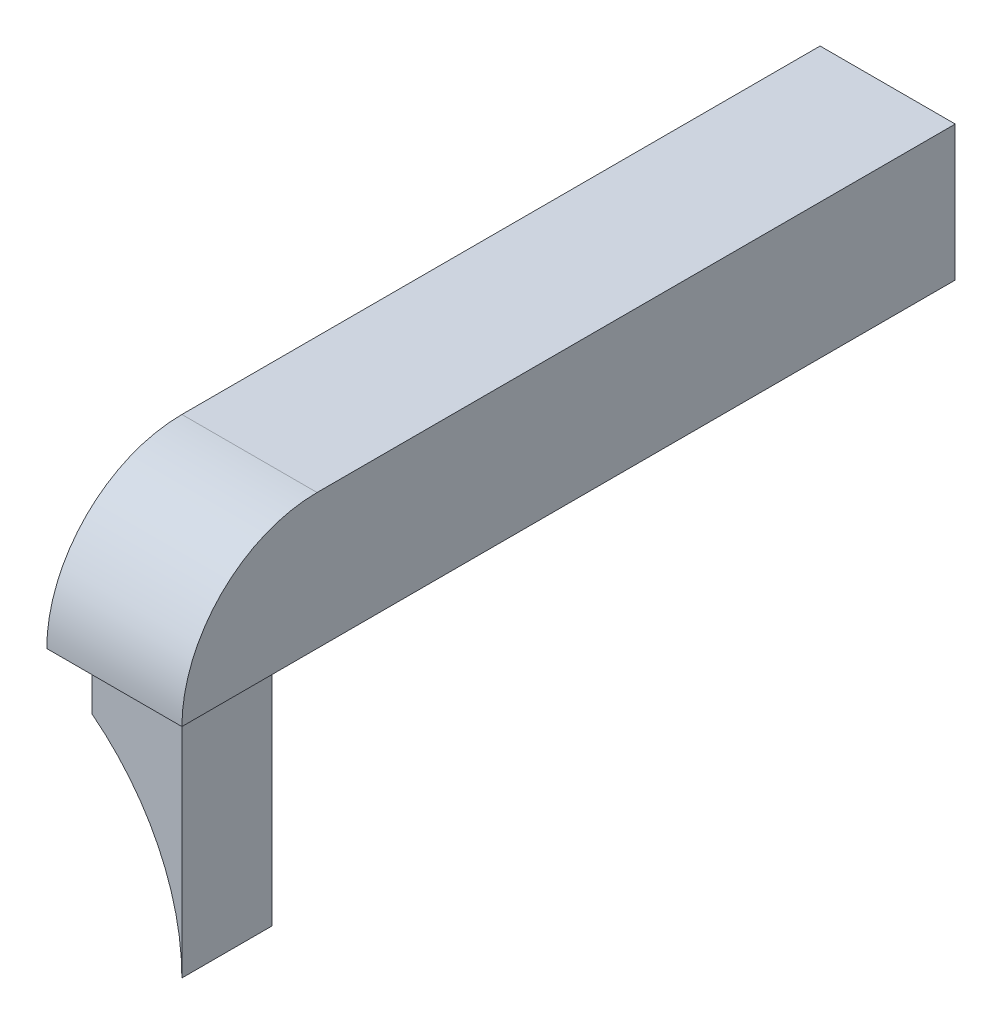
ISO-10303-21;
HEADER;
FILE_DESCRIPTION(('STEP AP214'),'2;1');
FILE_NAME('part.step','',(''),(''),'','','');
FILE_SCHEMA(('AUTOMOTIVE_DESIGN { 1 0 10303 214 1 1 1 1 }'));
ENDSEC;
DATA;
#1=APPLICATION_CONTEXT('core data for automotive mechanical design processes');
#2=APPLICATION_PROTOCOL_DEFINITION('international standard','automotive_design',2000,#1);
#3=PRODUCT_CONTEXT('',#1,'mechanical');
#4=PRODUCT('Part','Part','',(#3));
#5=PRODUCT_RELATED_PRODUCT_CATEGORY('part','',(#4));
#6=PRODUCT_DEFINITION_FORMATION('','',#4);
#7=PRODUCT_DEFINITION_CONTEXT('part definition',#1,'design');
#8=PRODUCT_DEFINITION('design','',#6,#7);
#9=PRODUCT_DEFINITION_SHAPE('','',#8);
#10=(LENGTH_UNIT() NAMED_UNIT(*) SI_UNIT(.MILLI.,.METRE.));
#11=(NAMED_UNIT(*) PLANE_ANGLE_UNIT() SI_UNIT($,.RADIAN.));
#12=(NAMED_UNIT(*) SI_UNIT($,.STERADIAN.) SOLID_ANGLE_UNIT());
#13=UNCERTAINTY_MEASURE_WITH_UNIT(LENGTH_MEASURE(1.E-05),#10,'distance_accuracy_value','');
#14=(GEOMETRIC_REPRESENTATION_CONTEXT(3) GLOBAL_UNCERTAINTY_ASSIGNED_CONTEXT((#13)) GLOBAL_UNIT_ASSIGNED_CONTEXT((#10,
#11,#12)) REPRESENTATION_CONTEXT('',''));
#15=CARTESIAN_POINT('',(0.,0.,0.));
#16=DIRECTION('',(0.,0.,1.));
#17=DIRECTION('',(1.,0.,0.));
#18=AXIS2_PLACEMENT_3D('',#15,#16,#17);
#19=CARTESIAN_POINT('',(13.7705009063984,28.2267058219209,96.5230796597994));
#20=DIRECTION('',(1.,0.,0.));
#21=DIRECTION('',(0.,0.,-1.));
#22=AXIS2_PLACEMENT_3D('',#19,#20,#21);
#23=CYLINDRICAL_SURFACE('',#22,13.2426406871193);
#24=CARTESIAN_POINT('',(27.0131415935177,28.2267058219209,96.5230796597994));
#25=DIRECTION('',(-1.,0.,0.));
#26=DIRECTION('',(0.,0.,1.));
#27=AXIS2_PLACEMENT_3D('',#24,#25,#26);
#28=CIRCLE('',#27,13.2426406871193);
#29=CARTESIAN_POINT('',(27.0131415935177,41.4693465090402,96.5230796597994));
#30=VERTEX_POINT('',#29);
#31=CARTESIAN_POINT('',(27.0131415935177,33.619477968083,108.617935630324));
#32=VERTEX_POINT('',#31);
#33=EDGE_CURVE('E248',#30,#32,#28,.F.);
#34=ORIENTED_EDGE('',*,*,#33,.T.);
#35=DIRECTION('',(1.,0.,0.));
#36=VECTOR('',#35,1.);
#37=CARTESIAN_POINT('',(13.7705009063984,33.619477968083,108.617935630324));
#38=LINE('',#37,#36);
#39=CARTESIAN_POINT('',(18.5278602192791,33.619477968083,108.617935630324));
#40=VERTEX_POINT('',#39);
#41=EDGE_CURVE('E60',#32,#40,#38,.F.);
#42=ORIENTED_EDGE('',*,*,#41,.T.);
#43=CARTESIAN_POINT('',(18.5278602192791,28.2267058219209,96.5230796597994));
#44=DIRECTION('',(1.,0.,0.));
#45=DIRECTION('',(0.,0.,-1.));
#46=AXIS2_PLACEMENT_3D('',#43,#44,#45);
#47=CIRCLE('',#46,13.2426406871193);
#48=CARTESIAN_POINT('',(18.5278602192791,41.4693465090402,96.5230796597994));
#49=VERTEX_POINT('',#48);
#50=EDGE_CURVE('E249',#49,#40,#47,.T.);
#51=ORIENTED_EDGE('',*,*,#50,.F.);
#52=DIRECTION('',(1.,0.,0.));
#53=VECTOR('',#52,1.);
#54=CARTESIAN_POINT('',(13.7705009063984,41.4693465090402,96.5230796597994));
#55=LINE('',#54,#53);
#56=EDGE_CURVE('E262',#49,#30,#55,.T.);
#57=ORIENTED_EDGE('',*,*,#56,.T.);
#58=EDGE_LOOP('',(#34,#42,#51,#57));
#59=FACE_BOUND('',#58,.T.);
#60=ADVANCED_FACE('F38',(#59),#23,.F.);
#61=CARTESIAN_POINT('',(13.7705009063984,46.2267058219209,11.5230796597994));
#62=DIRECTION('',(0.,0.,-1.));
#63=DIRECTION('',(-1.,0.,0.));
#64=AXIS2_PLACEMENT_3D('',#61,#62,#63);
#65=PLANE('',#64);
#66=DIRECTION('',(0.,1.,0.));
#67=VECTOR('',#66,1.);
#68=CARTESIAN_POINT('',(31.7705009063984,46.2267058219209,11.5230796597994));
#69=LINE('',#68,#67);
#70=CARTESIAN_POINT('',(31.7705009063984,28.2267058219209,11.5230796597994));
#71=VERTEX_POINT('',#70);
#72=CARTESIAN_POINT('',(31.7705009063984,46.2267058219209,11.5230796597994));
#73=VERTEX_POINT('',#72);
#74=EDGE_CURVE('E300',#71,#73,#69,.T.);
#75=ORIENTED_EDGE('',*,*,#74,.F.);
#76=DIRECTION('',(1.,0.,0.));
#77=VECTOR('',#76,1.);
#78=CARTESIAN_POINT('',(13.7705009063984,28.2267058219209,11.5230796597994));
#79=LINE('',#78,#77);
#80=CARTESIAN_POINT('',(13.7705009063984,28.2267058219209,11.5230796597994));
#81=VERTEX_POINT('',#80);
#82=EDGE_CURVE('E297',#81,#71,#79,.T.);
#83=ORIENTED_EDGE('',*,*,#82,.F.);
#84=DIRECTION('',(0.,1.,0.));
#85=VECTOR('',#84,1.);
#86=CARTESIAN_POINT('',(13.7705009063984,46.2267058219209,11.5230796597994));
#87=LINE('',#86,#85);
#88=CARTESIAN_POINT('',(13.7705009063984,46.2267058219209,11.5230796597994));
#89=VERTEX_POINT('',#88);
#90=EDGE_CURVE('E284',#81,#89,#87,.T.);
#91=ORIENTED_EDGE('',*,*,#90,.T.);
#92=DIRECTION('',(1.,0.,0.));
#93=VECTOR('',#92,1.);
#94=CARTESIAN_POINT('',(13.7705009063984,46.2267058219209,11.5230796597994));
#95=LINE('',#94,#93);
#96=EDGE_CURVE('E315',#89,#73,#95,.T.);
#97=ORIENTED_EDGE('',*,*,#96,.T.);
#98=EDGE_LOOP('',(#75,#83,#91,#97));
#99=FACE_BOUND('',#98,.T.);
#100=DIRECTION('',(1.,0.,0.));
#101=VECTOR('',#100,1.);
#102=CARTESIAN_POINT('',(13.7705009063984,32.9840651348016,11.5230796597994));
#103=LINE('',#102,#101);
#104=CARTESIAN_POINT('',(18.5278602192791,32.9840651348016,11.5230796597994));
#105=VERTEX_POINT('',#104);
#106=CARTESIAN_POINT('',(27.0131415935177,32.9840651348016,11.5230796597994));
#107=VERTEX_POINT('',#106);
#108=EDGE_CURVE('E252',#105,#107,#103,.T.);
#109=ORIENTED_EDGE('',*,*,#108,.T.);
#110=DIRECTION('',(0.,1.,0.));
#111=VECTOR('',#110,1.);
#112=CARTESIAN_POINT('',(27.0131415935177,46.2267058219209,11.5230796597994));
#113=LINE('',#112,#111);
#114=CARTESIAN_POINT('',(27.0131415935177,41.4693465090402,11.5230796597994));
#115=VERTEX_POINT('',#114);
#116=EDGE_CURVE('E261',#107,#115,#113,.T.);
#117=ORIENTED_EDGE('',*,*,#116,.T.);
#118=DIRECTION('',(1.,0.,0.));
#119=VECTOR('',#118,1.);
#120=CARTESIAN_POINT('',(13.7705009063984,41.4693465090402,11.5230796597994));
#121=LINE('',#120,#119);
#122=CARTESIAN_POINT('',(18.5278602192791,41.4693465090402,11.5230796597994));
#123=VERTEX_POINT('',#122);
#124=EDGE_CURVE('E266',#123,#115,#121,.T.);
#125=ORIENTED_EDGE('',*,*,#124,.F.);
#126=DIRECTION('',(0.,1.,0.));
#127=VECTOR('',#126,1.);
#128=CARTESIAN_POINT('',(18.5278602192791,28.2267058219209,11.5230796597994));
#129=LINE('',#128,#127);
#130=EDGE_CURVE('E247',#105,#123,#129,.T.);
#131=ORIENTED_EDGE('',*,*,#130,.F.);
#132=EDGE_LOOP('',(#109,#117,#125,#131));
#133=FACE_BOUND('',#132,.T.);
#134=ADVANCED_FACE('F360',(#99,#133),#65,.T.);
#135=CARTESIAN_POINT('',(13.7705009063984,28.2267058219209,114.523079659799));
#136=DIRECTION('',(1.,0.,0.));
#137=DIRECTION('',(0.,0.,-1.));
#138=AXIS2_PLACEMENT_3D('',#135,#136,#137);
#139=PLANE('',#138);
#140=DIRECTION('',(0.,0.,-1.));
#141=VECTOR('',#140,1.);
#142=CARTESIAN_POINT('',(13.7705009063984,28.2267058219209,114.523079659799));
#143=LINE('',#142,#141);
#144=CARTESIAN_POINT('',(13.7705009063984,28.2267058219209,114.523079659799));
#145=VERTEX_POINT('',#144);
#146=EDGE_CURVE('E281',#145,#81,#143,.T.);
#147=ORIENTED_EDGE('',*,*,#146,.F.);
#148=CARTESIAN_POINT('',(13.7705009063984,28.2267058219209,96.5230796597994));
#149=DIRECTION('',(1.,0.,0.));
#150=DIRECTION('',(0.,0.,1.));
#151=AXIS2_PLACEMENT_3D('',#148,#149,#150);
#152=CIRCLE('',#151,18.);
#153=CARTESIAN_POINT('',(13.7705009063984,46.2267058219209,96.5230796597994));
#154=VERTEX_POINT('',#153);
#155=EDGE_CURVE('E293',#154,#145,#152,.T.);
#156=ORIENTED_EDGE('',*,*,#155,.F.);
#157=DIRECTION('',(0.,0.,1.));
#158=VECTOR('',#157,1.);
#159=CARTESIAN_POINT('',(13.7705009063984,46.2267058219209,96.5230796597994));
#160=LINE('',#159,#158);
#161=EDGE_CURVE('E289',#89,#154,#160,.T.);
#162=ORIENTED_EDGE('',*,*,#161,.F.);
#163=ORIENTED_EDGE('',*,*,#90,.F.);
#164=EDGE_LOOP('',(#147,#156,#162,#163));
#165=FACE_BOUND('',#164,.T.);
#166=ADVANCED_FACE('F367',(#165),#139,.F.);
#167=CARTESIAN_POINT('',(13.7705009063984,46.2267058219209,96.5230796597994));
#168=DIRECTION('',(0.,1.,0.));
#169=DIRECTION('',(0.,0.,1.));
#170=AXIS2_PLACEMENT_3D('',#167,#168,#169);
#171=PLANE('',#170);
#172=DIRECTION('',(0.,0.,1.));
#173=VECTOR('',#172,1.);
#174=CARTESIAN_POINT('',(31.7705009063984,46.2267058219209,96.5230796597994));
#175=LINE('',#174,#173);
#176=CARTESIAN_POINT('',(31.7705009063984,46.2267058219209,96.5230796597994));
#177=VERTEX_POINT('',#176);
#178=EDGE_CURVE('E304',#73,#177,#175,.T.);
#179=ORIENTED_EDGE('',*,*,#178,.F.);
#180=ORIENTED_EDGE('',*,*,#96,.F.);
#181=ORIENTED_EDGE('',*,*,#161,.T.);
#182=DIRECTION('',(1.,0.,0.));
#183=VECTOR('',#182,1.);
#184=CARTESIAN_POINT('',(13.7705009063984,46.2267058219209,96.5230796597994));
#185=LINE('',#184,#183);
#186=EDGE_CURVE('E311',#154,#177,#185,.T.);
#187=ORIENTED_EDGE('',*,*,#186,.T.);
#188=EDGE_LOOP('',(#179,#180,#181,#187));
#189=FACE_BOUND('',#188,.T.);
#190=ADVANCED_FACE('F383',(#189),#171,.T.);
#191=CARTESIAN_POINT('',(31.7705009063984,28.2267058219209,114.523079659799));
#192=DIRECTION('',(-1.,0.,0.));
#193=DIRECTION('',(0.,0.,1.));
#194=AXIS2_PLACEMENT_3D('',#191,#192,#193);
#195=PLANE('',#194);
#196=CARTESIAN_POINT('',(31.7705009063984,28.2267058219209,96.5230796597994));
#197=DIRECTION('',(1.,0.,0.));
#198=DIRECTION('',(0.,0.,1.));
#199=AXIS2_PLACEMENT_3D('',#196,#197,#198);
#200=CIRCLE('',#199,18.);
#201=CARTESIAN_POINT('',(31.7705009063984,28.2267058219209,114.523079659799));
#202=VERTEX_POINT('',#201);
#203=EDGE_CURVE('E285',#177,#202,#200,.T.);
#204=ORIENTED_EDGE('',*,*,#203,.T.);
#205=DIRECTION('',(0.,0.,-1.));
#206=VECTOR('',#205,1.);
#207=CARTESIAN_POINT('',(31.7705009063984,28.2267058219209,96.5230796597994));
#208=LINE('',#207,#206);
#209=EDGE_CURVE('E265',#202,#71,#208,.T.);
#210=ORIENTED_EDGE('',*,*,#209,.T.);
#211=ORIENTED_EDGE('',*,*,#74,.T.);
#212=ORIENTED_EDGE('',*,*,#178,.T.);
#213=EDGE_LOOP('',(#204,#210,#211,#212));
#214=FACE_BOUND('',#213,.T.);
#215=ADVANCED_FACE('F381',(#214),#195,.F.);
#216=CARTESIAN_POINT('',(13.7705009063984,28.2267058219209,96.5230796597994));
#217=DIRECTION('',(1.,0.,0.));
#218=DIRECTION('',(0.,0.,-1.));
#219=AXIS2_PLACEMENT_3D('',#216,#217,#218);
#220=CYLINDRICAL_SURFACE('',#219,18.);
#221=ORIENTED_EDGE('',*,*,#203,.F.);
#222=ORIENTED_EDGE('',*,*,#186,.F.);
#223=ORIENTED_EDGE('',*,*,#155,.T.);
#224=DIRECTION('',(1.,0.,0.));
#225=VECTOR('',#224,1.);
#226=CARTESIAN_POINT('',(13.7705009063984,28.2267058219209,114.523079659799));
#227=LINE('',#226,#225);
#228=EDGE_CURVE('E314',#145,#202,#227,.T.);
#229=ORIENTED_EDGE('',*,*,#228,.T.);
#230=EDGE_LOOP('',(#221,#222,#223,#229));
#231=FACE_BOUND('',#230,.T.);
#232=ADVANCED_FACE('F378',(#231),#220,.T.);
#233=CARTESIAN_POINT('',(13.7705009063984,28.2267058219209,96.5230796597994));
#234=DIRECTION('',(0.,-1.,0.));
#235=DIRECTION('',(0.,0.,-1.));
#236=AXIS2_PLACEMENT_3D('',#233,#234,#235);
#237=PLANE('',#236);
#238=DIRECTION('',(-1.,0.,0.));
#239=VECTOR('',#238,1.);
#240=CARTESIAN_POINT('',(28.7705009063984,28.2267058219209,111.523079659799));
#241=LINE('',#240,#239);
#242=CARTESIAN_POINT('',(28.7705009063984,28.2267058219209,111.523079659799));
#243=VERTEX_POINT('',#242);
#244=CARTESIAN_POINT('',(16.7705009063984,28.2267058219209,111.523079659799));
#245=VERTEX_POINT('',#244);
#246=EDGE_CURVE('E209',#243,#245,#241,.T.);
#247=ORIENTED_EDGE('',*,*,#246,.F.);
#248=DIRECTION('',(0.,0.,-1.));
#249=VECTOR('',#248,1.);
#250=CARTESIAN_POINT('',(28.7705009063984,28.2267058219209,111.523079659799));
#251=LINE('',#250,#249);
#252=CARTESIAN_POINT('',(28.7705009063984,28.2267058219209,99.5230796597994));
#253=VERTEX_POINT('',#252);
#254=EDGE_CURVE('E235',#243,#253,#251,.T.);
#255=ORIENTED_EDGE('',*,*,#254,.T.);
#256=DIRECTION('',(-1.,0.,0.));
#257=VECTOR('',#256,1.);
#258=CARTESIAN_POINT('',(28.7705009063984,28.2267058219209,99.5230796597994));
#259=LINE('',#258,#257);
#260=CARTESIAN_POINT('',(16.7705009063984,28.2267058219209,99.5230796597994));
#261=VERTEX_POINT('',#260);
#262=EDGE_CURVE('E222',#253,#261,#259,.T.);
#263=ORIENTED_EDGE('',*,*,#262,.T.);
#264=DIRECTION('',(0.,0.,-1.));
#265=VECTOR('',#264,1.);
#266=CARTESIAN_POINT('',(16.7705009063984,28.2267058219209,111.523079659799));
#267=LINE('',#266,#265);
#268=EDGE_CURVE('E231',#245,#261,#267,.T.);
#269=ORIENTED_EDGE('',*,*,#268,.F.);
#270=EDGE_LOOP('',(#247,#255,#263,#269));
#271=FACE_BOUND('',#270,.T.);
#272=ORIENTED_EDGE('',*,*,#209,.F.);
#273=ORIENTED_EDGE('',*,*,#228,.F.);
#274=ORIENTED_EDGE('',*,*,#146,.T.);
#275=ORIENTED_EDGE('',*,*,#82,.T.);
#276=EDGE_LOOP('',(#272,#273,#274,#275));
#277=FACE_BOUND('',#276,.T.);
#278=ADVANCED_FACE('F370',(#271,#277),#237,.T.);
#279=CARTESIAN_POINT('',(18.5278602192791,28.2267058219209,114.523079659799));
#280=DIRECTION('',(1.,0.,0.));
#281=DIRECTION('',(0.,0.,-1.));
#282=AXIS2_PLACEMENT_3D('',#279,#280,#281);
#283=PLANE('',#282);
#284=DIRECTION('',(0.,-1.,0.));
#285=VECTOR('',#284,1.);
#286=CARTESIAN_POINT('',(18.5278602192791,33.0267058219209,101.28043897268));
#287=LINE('',#286,#285);
#288=CARTESIAN_POINT('',(18.5278602192791,32.9840651348016,101.28043897268));
#289=VERTEX_POINT('',#288);
#290=CARTESIAN_POINT('',(18.5278602192791,19.2513021127566,101.28043897268));
#291=VERTEX_POINT('',#290);
#292=EDGE_CURVE('E186',#289,#291,#287,.T.);
#293=ORIENTED_EDGE('',*,*,#292,.F.);
#294=DIRECTION('',(0.,0.,-1.));
#295=VECTOR('',#294,1.);
#296=CARTESIAN_POINT('',(18.5278602192791,32.9840651348016,114.523079659799));
#297=LINE('',#296,#295);
#298=EDGE_CURVE('E244',#289,#105,#297,.T.);
#299=ORIENTED_EDGE('',*,*,#298,.T.);
#300=ORIENTED_EDGE('',*,*,#130,.T.);
#301=DIRECTION('',(0.,0.,1.));
#302=VECTOR('',#301,1.);
#303=CARTESIAN_POINT('',(18.5278602192791,41.4693465090402,114.523079659799));
#304=LINE('',#303,#302);
#305=EDGE_CURVE('E253',#123,#49,#304,.T.);
#306=ORIENTED_EDGE('',*,*,#305,.T.);
#307=ORIENTED_EDGE('',*,*,#50,.T.);
#308=CARTESIAN_POINT('',(18.5278602192791,34.0267058219209,109.531262228567));
#309=DIRECTION('',(1.,0.,0.));
#310=DIRECTION('',(0.,0.,-1.));
#311=AXIS2_PLACEMENT_3D('',#308,#309,#310);
#312=CIRCLE('',#311,1.);
#313=CARTESIAN_POINT('',(18.5278602192791,33.0267058219209,109.531262228567));
#314=VERTEX_POINT('',#313);
#315=EDGE_CURVE('E11',#40,#314,#312,.F.);
#316=ORIENTED_EDGE('',*,*,#315,.T.);
#317=DIRECTION('',(0.,0.,-1.));
#318=VECTOR('',#317,1.);
#319=CARTESIAN_POINT('',(18.5278602192791,33.0267058219209,109.765720346919));
#320=LINE('',#319,#318);
#321=CARTESIAN_POINT('',(18.5278602192791,33.0267058219209,109.765720346919));
#322=VERTEX_POINT('',#321);
#323=EDGE_CURVE('E167',#322,#314,#320,.T.);
#324=ORIENTED_EDGE('',*,*,#323,.F.);
#325=DIRECTION('',(0.,-1.,0.));
#326=VECTOR('',#325,1.);
#327=CARTESIAN_POINT('',(18.5278602192791,33.0267058219209,109.765720346919));
#328=LINE('',#327,#326);
#329=CARTESIAN_POINT('',(18.5278602192791,19.2513021127566,109.765720346919));
#330=VERTEX_POINT('',#329);
#331=EDGE_CURVE('E179',#322,#330,#328,.T.);
#332=ORIENTED_EDGE('',*,*,#331,.T.);
#333=DIRECTION('',(0.,0.,-1.));
#334=VECTOR('',#333,1.);
#335=CARTESIAN_POINT('',(18.5278602192791,19.2513021127566,111.523079659799));
#336=LINE('',#335,#334);
#337=EDGE_CURVE('E333',#291,#330,#336,.F.);
#338=ORIENTED_EDGE('',*,*,#337,.F.);
#339=EDGE_LOOP('',(#293,#299,#300,#306,#307,#316,#324,#332,#338));
#340=FACE_BOUND('',#339,.T.);
#341=ADVANCED_FACE('F347',(#340),#283,.T.);
#342=CARTESIAN_POINT('',(13.7705009063984,41.4693465090402,96.5230796597994));
#343=DIRECTION('',(0.,1.,0.));
#344=DIRECTION('',(0.,0.,1.));
#345=AXIS2_PLACEMENT_3D('',#342,#343,#344);
#346=PLANE('',#345);
#347=DIRECTION('',(0.,0.,1.));
#348=VECTOR('',#347,1.);
#349=CARTESIAN_POINT('',(27.0131415935177,41.4693465090402,96.5230796597994));
#350=LINE('',#349,#348);
#351=EDGE_CURVE('E257',#115,#30,#350,.T.);
#352=ORIENTED_EDGE('',*,*,#351,.T.);
#353=ORIENTED_EDGE('',*,*,#56,.F.);
#354=ORIENTED_EDGE('',*,*,#305,.F.);
#355=ORIENTED_EDGE('',*,*,#124,.T.);
#356=EDGE_LOOP('',(#352,#353,#354,#355));
#357=FACE_BOUND('',#356,.T.);
#358=ADVANCED_FACE('F413',(#357),#346,.F.);
#359=CARTESIAN_POINT('',(27.0131415935177,28.2267058219209,114.523079659799));
#360=DIRECTION('',(-1.,0.,0.));
#361=DIRECTION('',(0.,0.,1.));
#362=AXIS2_PLACEMENT_3D('',#359,#360,#361);
#363=PLANE('',#362);
#364=DIRECTION('',(0.,0.,-1.));
#365=VECTOR('',#364,1.);
#366=CARTESIAN_POINT('',(27.0131415935177,32.9840651348016,96.5230796597994));
#367=LINE('',#366,#365);
#368=CARTESIAN_POINT('',(27.0131415935177,32.9840651348016,101.28043897268));
#369=VERTEX_POINT('',#368);
#370=EDGE_CURVE('E243',#369,#107,#367,.T.);
#371=ORIENTED_EDGE('',*,*,#370,.F.);
#372=DIRECTION('',(0.,-1.,0.));
#373=VECTOR('',#372,1.);
#374=CARTESIAN_POINT('',(27.0131415935177,33.0267058219209,101.28043897268));
#375=LINE('',#374,#373);
#376=CARTESIAN_POINT('',(27.0131415935177,6.51592180974206,101.28043897268));
#377=VERTEX_POINT('',#376);
#378=EDGE_CURVE('E180',#369,#377,#375,.T.);
#379=ORIENTED_EDGE('',*,*,#378,.T.);
#380=DIRECTION('',(0.,0.,-1.));
#381=VECTOR('',#380,1.);
#382=CARTESIAN_POINT('',(27.0131415935177,6.51592180974206,111.523079659799));
#383=LINE('',#382,#381);
#384=CARTESIAN_POINT('',(27.0131415935177,6.51592180974206,109.765720346919));
#385=VERTEX_POINT('',#384);
#386=EDGE_CURVE('E175',#385,#377,#383,.T.);
#387=ORIENTED_EDGE('',*,*,#386,.F.);
#388=DIRECTION('',(0.,-1.,0.));
#389=VECTOR('',#388,1.);
#390=CARTESIAN_POINT('',(27.0131415935177,33.0267058219209,109.765720346919));
#391=LINE('',#390,#389);
#392=CARTESIAN_POINT('',(27.0131415935177,33.0267058219209,109.765720346919));
#393=VERTEX_POINT('',#392);
#394=EDGE_CURVE('E170',#393,#385,#391,.T.);
#395=ORIENTED_EDGE('',*,*,#394,.F.);
#396=DIRECTION('',(0.,0.,1.));
#397=VECTOR('',#396,1.);
#398=CARTESIAN_POINT('',(27.0131415935177,33.0267058219209,109.765720346919));
#399=LINE('',#398,#397);
#400=CARTESIAN_POINT('',(27.0131415935177,33.0267058219209,109.531262228567));
#401=VERTEX_POINT('',#400);
#402=EDGE_CURVE('E158',#401,#393,#399,.T.);
#403=ORIENTED_EDGE('',*,*,#402,.F.);
#404=CARTESIAN_POINT('',(27.0131415935177,34.0267058219209,109.531262228567));
#405=DIRECTION('',(-1.,0.,0.));
#406=DIRECTION('',(0.,0.,1.));
#407=AXIS2_PLACEMENT_3D('',#404,#405,#406);
#408=CIRCLE('',#407,1.);
#409=EDGE_CURVE('E47',#401,#32,#408,.F.);
#410=ORIENTED_EDGE('',*,*,#409,.T.);
#411=ORIENTED_EDGE('',*,*,#33,.F.);
#412=ORIENTED_EDGE('',*,*,#351,.F.);
#413=ORIENTED_EDGE('',*,*,#116,.F.);
#414=EDGE_LOOP('',(#371,#379,#387,#395,#403,#410,#411,#412,#413));
#415=FACE_BOUND('',#414,.T.);
#416=ADVANCED_FACE('F172',(#415),#363,.T.);
#417=CARTESIAN_POINT('',(13.7705009063984,32.9840651348016,96.5230796597994));
#418=DIRECTION('',(0.,-1.,0.));
#419=DIRECTION('',(0.,0.,-1.));
#420=AXIS2_PLACEMENT_3D('',#417,#418,#419);
#421=PLANE('',#420);
#422=ORIENTED_EDGE('',*,*,#298,.F.);
#423=DIRECTION('',(1.,0.,0.));
#424=VECTOR('',#423,1.);
#425=CARTESIAN_POINT('',(13.7705009063984,32.9840651348016,101.28043897268));
#426=LINE('',#425,#424);
#427=EDGE_CURVE('E193',#289,#369,#426,.T.);
#428=ORIENTED_EDGE('',*,*,#427,.T.);
#429=ORIENTED_EDGE('',*,*,#370,.T.);
#430=ORIENTED_EDGE('',*,*,#108,.F.);
#431=EDGE_LOOP('',(#422,#428,#429,#430));
#432=FACE_BOUND('',#431,.T.);
#433=ADVANCED_FACE('F374',(#432),#421,.F.);
#434=CARTESIAN_POINT('',(-2.22949909360185,-3.77329417807921,111.523079659799));
#435=DIRECTION('',(0.,0.,-1.));
#436=DIRECTION('',(-1.,0.,0.));
#437=AXIS2_PLACEMENT_3D('',#434,#435,#436);
#438=CYLINDRICAL_SURFACE('',#437,31.0000000000003);
#439=CARTESIAN_POINT('',(-2.22949909360185,-3.77329417807921,101.28043897268));
#440=DIRECTION('',(0.,0.,-1.));
#441=DIRECTION('',(-1.,0.,0.));
#442=AXIS2_PLACEMENT_3D('',#439,#440,#441);
#443=CIRCLE('',#442,31.0000000000003);
#444=EDGE_CURVE('E324',#377,#291,#443,.F.);
#445=ORIENTED_EDGE('',*,*,#444,.T.);
#446=ORIENTED_EDGE('',*,*,#337,.T.);
#447=CARTESIAN_POINT('',(-2.22949909360185,-3.77329417807921,109.765720346919));
#448=DIRECTION('',(0.,0.,1.));
#449=DIRECTION('',(1.,0.,0.));
#450=AXIS2_PLACEMENT_3D('',#447,#448,#449);
#451=CIRCLE('',#450,31.0000000000003);
#452=EDGE_CURVE('E330',#330,#385,#451,.F.);
#453=ORIENTED_EDGE('',*,*,#452,.T.);
#454=ORIENTED_EDGE('',*,*,#386,.T.);
#455=EDGE_LOOP('',(#445,#446,#453,#454));
#456=FACE_BOUND('',#455,.T.);
#457=CARTESIAN_POINT('',(-2.22949909360185,-3.77329417807921,99.5230796597994));
#458=DIRECTION('',(0.,0.,-1.));
#459=DIRECTION('',(1.,0.,0.));
#460=AXIS2_PLACEMENT_3D('',#457,#458,#459);
#461=CIRCLE('',#460,31.0000000000003);
#462=CARTESIAN_POINT('',(16.7705009063984,20.7216032497527,99.5230796597994));
#463=VERTEX_POINT('',#462);
#464=CARTESIAN_POINT('',(28.7705009063984,-3.77329417807919,99.5230796597994));
#465=VERTEX_POINT('',#464);
#466=EDGE_CURVE('E200',#463,#465,#461,.T.);
#467=ORIENTED_EDGE('',*,*,#466,.T.);
#468=DIRECTION('',(0.,0.,-1.));
#469=VECTOR('',#468,1.);
#470=CARTESIAN_POINT('',(28.7705009063984,-3.77329417807919,111.523079659799));
#471=LINE('',#470,#469);
#472=CARTESIAN_POINT('',(28.7705009063984,-3.77329417807919,111.523079659799));
#473=VERTEX_POINT('',#472);
#474=EDGE_CURVE('E239',#473,#465,#471,.T.);
#475=ORIENTED_EDGE('',*,*,#474,.F.);
#476=CARTESIAN_POINT('',(-2.22949909360185,-3.77329417807921,111.523079659799));
#477=DIRECTION('',(0.,0.,-1.));
#478=DIRECTION('',(1.,0.,0.));
#479=AXIS2_PLACEMENT_3D('',#476,#477,#478);
#480=CIRCLE('',#479,31.0000000000003);
#481=CARTESIAN_POINT('',(16.7705009063984,20.7216032497527,111.523079659799));
#482=VERTEX_POINT('',#481);
#483=EDGE_CURVE('E201',#482,#473,#480,.T.);
#484=ORIENTED_EDGE('',*,*,#483,.F.);
#485=DIRECTION('',(0.,0.,-1.));
#486=VECTOR('',#485,1.);
#487=CARTESIAN_POINT('',(16.7705009063984,20.7216032497527,111.523079659799));
#488=LINE('',#487,#486);
#489=EDGE_CURVE('E215',#482,#463,#488,.T.);
#490=ORIENTED_EDGE('',*,*,#489,.T.);
#491=EDGE_LOOP('',(#467,#475,#484,#490));
#492=FACE_BOUND('',#491,.T.);
#493=ADVANCED_FACE('F343',(#456,#492),#438,.F.);
#494=CARTESIAN_POINT('',(28.7705009063984,-3.77329417807919,111.523079659799));
#495=DIRECTION('',(-1.,0.,0.));
#496=DIRECTION('',(0.,-1.,0.));
#497=AXIS2_PLACEMENT_3D('',#494,#495,#496);
#498=PLANE('',#497);
#499=DIRECTION('',(0.,1.,0.));
#500=VECTOR('',#499,1.);
#501=CARTESIAN_POINT('',(28.7705009063984,-3.77329417807919,99.5230796597994));
#502=LINE('',#501,#500);
#503=EDGE_CURVE('E219',#465,#253,#502,.T.);
#504=ORIENTED_EDGE('',*,*,#503,.T.);
#505=ORIENTED_EDGE('',*,*,#254,.F.);
#506=DIRECTION('',(0.,1.,0.));
#507=VECTOR('',#506,1.);
#508=CARTESIAN_POINT('',(28.7705009063984,-3.77329417807919,111.523079659799));
#509=LINE('',#508,#507);
#510=EDGE_CURVE('E205',#473,#243,#509,.T.);
#511=ORIENTED_EDGE('',*,*,#510,.F.);
#512=ORIENTED_EDGE('',*,*,#474,.T.);
#513=EDGE_LOOP('',(#504,#505,#511,#512));
#514=FACE_BOUND('',#513,.T.);
#515=ADVANCED_FACE('F425',(#514),#498,.F.);
#516=CARTESIAN_POINT('',(16.7705009063984,28.2267058219209,111.523079659799));
#517=DIRECTION('',(1.,0.,0.));
#518=DIRECTION('',(0.,0.,-1.));
#519=AXIS2_PLACEMENT_3D('',#516,#517,#518);
#520=PLANE('',#519);
#521=DIRECTION('',(0.,-1.,0.));
#522=VECTOR('',#521,1.);
#523=CARTESIAN_POINT('',(16.7705009063984,28.2267058219209,99.5230796597994));
#524=LINE('',#523,#522);
#525=EDGE_CURVE('E206',#261,#463,#524,.T.);
#526=ORIENTED_EDGE('',*,*,#525,.T.);
#527=ORIENTED_EDGE('',*,*,#489,.F.);
#528=DIRECTION('',(0.,-1.,0.));
#529=VECTOR('',#528,1.);
#530=CARTESIAN_POINT('',(16.7705009063984,28.2267058219209,111.523079659799));
#531=LINE('',#530,#529);
#532=EDGE_CURVE('E212',#245,#482,#531,.T.);
#533=ORIENTED_EDGE('',*,*,#532,.F.);
#534=ORIENTED_EDGE('',*,*,#268,.T.);
#535=EDGE_LOOP('',(#526,#527,#533,#534));
#536=FACE_BOUND('',#535,.T.);
#537=ADVANCED_FACE('F428',(#536),#520,.F.);
#538=CARTESIAN_POINT('',(-2.22949909360185,-3.77329417807921,111.523079659799));
#539=DIRECTION('',(0.,0.,1.));
#540=DIRECTION('',(1.,0.,0.));
#541=AXIS2_PLACEMENT_3D('',#538,#539,#540);
#542=PLANE('',#541);
#543=ORIENTED_EDGE('',*,*,#483,.T.);
#544=ORIENTED_EDGE('',*,*,#510,.T.);
#545=ORIENTED_EDGE('',*,*,#246,.T.);
#546=ORIENTED_EDGE('',*,*,#532,.T.);
#547=EDGE_LOOP('',(#543,#544,#545,#546));
#548=FACE_BOUND('',#547,.T.);
#549=ADVANCED_FACE('F432',(#548),#542,.T.);
#550=CARTESIAN_POINT('',(-2.22949909360185,-3.77329417807921,99.5230796597994));
#551=DIRECTION('',(0.,0.,1.));
#552=DIRECTION('',(1.,0.,0.));
#553=AXIS2_PLACEMENT_3D('',#550,#551,#552);
#554=PLANE('',#553);
#555=ORIENTED_EDGE('',*,*,#466,.F.);
#556=ORIENTED_EDGE('',*,*,#525,.F.);
#557=ORIENTED_EDGE('',*,*,#262,.F.);
#558=ORIENTED_EDGE('',*,*,#503,.F.);
#559=EDGE_LOOP('',(#555,#556,#557,#558));
#560=FACE_BOUND('',#559,.T.);
#561=ADVANCED_FACE('F434',(#560),#554,.F.);
#562=CARTESIAN_POINT('',(0.,33.0267058219209,0.));
#563=DIRECTION('',(0.,-1.,0.));
#564=DIRECTION('',(0.,0.,-1.));
#565=AXIS2_PLACEMENT_3D('',#562,#563,#564);
#566=PLANE('',#565);
#567=ORIENTED_EDGE('',*,*,#323,.T.);
#568=DIRECTION('',(-1.,0.,0.));
#569=VECTOR('',#568,1.);
#570=CARTESIAN_POINT('',(27.0131415935177,33.0267058219209,109.531262228567));
#571=LINE('',#570,#569);
#572=EDGE_CURVE('E165',#314,#401,#571,.F.);
#573=ORIENTED_EDGE('',*,*,#572,.T.);
#574=ORIENTED_EDGE('',*,*,#402,.T.);
#575=DIRECTION('',(-1.,0.,0.));
#576=VECTOR('',#575,1.);
#577=CARTESIAN_POINT('',(18.5278602192791,33.0267058219209,109.765720346919));
#578=LINE('',#577,#576);
#579=EDGE_CURVE('E163',#393,#322,#578,.T.);
#580=ORIENTED_EDGE('',*,*,#579,.T.);
#581=EDGE_LOOP('',(#567,#573,#574,#580));
#582=FACE_BOUND('',#581,.T.);
#583=ADVANCED_FACE('F161',(#582),#566,.T.);
#584=CARTESIAN_POINT('',(18.5278602192791,33.0267058219209,109.765720346919));
#585=DIRECTION('',(0.,0.,1.));
#586=DIRECTION('',(1.,0.,0.));
#587=AXIS2_PLACEMENT_3D('',#584,#585,#586);
#588=PLANE('',#587);
#589=ORIENTED_EDGE('',*,*,#331,.F.);
#590=ORIENTED_EDGE('',*,*,#579,.F.);
#591=ORIENTED_EDGE('',*,*,#394,.T.);
#592=ORIENTED_EDGE('',*,*,#452,.F.);
#593=EDGE_LOOP('',(#589,#590,#591,#592));
#594=FACE_BOUND('',#593,.T.);
#595=ADVANCED_FACE('F182',(#594),#588,.F.);
#596=CARTESIAN_POINT('',(18.5278602192791,33.0267058219209,101.28043897268));
#597=DIRECTION('',(0.,0.,-1.));
#598=DIRECTION('',(-1.,0.,0.));
#599=AXIS2_PLACEMENT_3D('',#596,#597,#598);
#600=PLANE('',#599);
#601=ORIENTED_EDGE('',*,*,#292,.T.);
#602=ORIENTED_EDGE('',*,*,#444,.F.);
#603=ORIENTED_EDGE('',*,*,#378,.F.);
#604=ORIENTED_EDGE('',*,*,#427,.F.);
#605=EDGE_LOOP('',(#601,#602,#603,#604));
#606=FACE_BOUND('',#605,.T.);
#607=ADVANCED_FACE('F353',(#606),#600,.F.);
#608=CARTESIAN_POINT('',(13.7705009063984,34.0267058219209,109.531262228567));
#609=DIRECTION('',(1.,0.,0.));
#610=DIRECTION('',(0.,0.,-1.));
#611=AXIS2_PLACEMENT_3D('',#608,#609,#610);
#612=CYLINDRICAL_SURFACE('',#611,1.);
#613=ORIENTED_EDGE('',*,*,#315,.F.);
#614=ORIENTED_EDGE('',*,*,#41,.F.);
#615=ORIENTED_EDGE('',*,*,#409,.F.);
#616=ORIENTED_EDGE('',*,*,#572,.F.);
#617=EDGE_LOOP('',(#613,#614,#615,#616));
#618=FACE_BOUND('',#617,.T.);
#619=ADVANCED_FACE('F40',(#618),#612,.T.);
#620=CLOSED_SHELL('',(#60,#134,#166,#190,#215,#232,#278,#341,#358,#416,#433,#493,#515,#537,#549,
#561,#583,#595,#607,#619));
#621=MANIFOLD_SOLID_BREP('B2',#620);
#622=ADVANCED_BREP_SHAPE_REPRESENTATION('',(#18,#621),#14);
#623=SHAPE_DEFINITION_REPRESENTATION(#9,#622);
ENDSEC;
END-ISO-10303-21;
